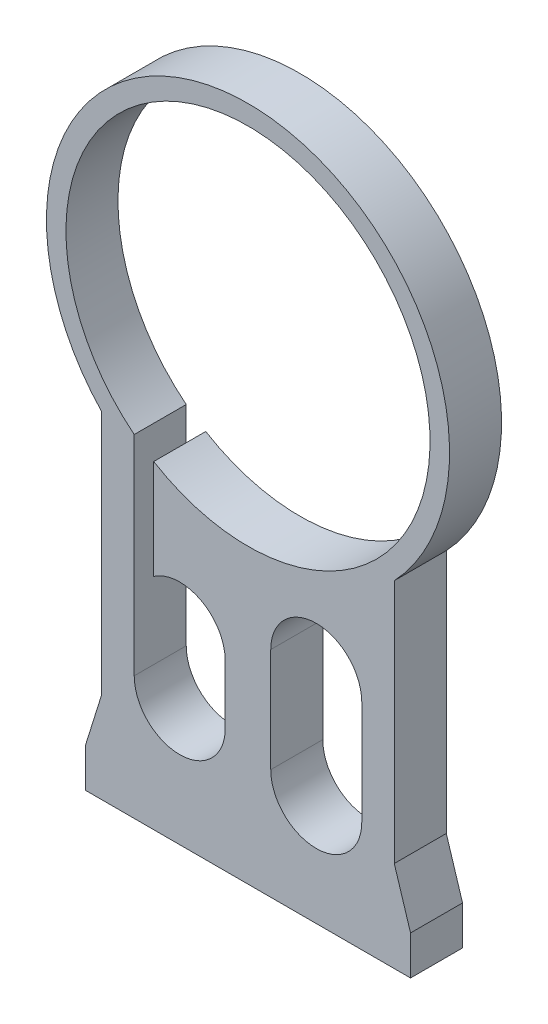
ISO-10303-21;
HEADER;
FILE_DESCRIPTION(('STEP AP214'),'2;1');
FILE_NAME('part.step','',(''),(''),'','','');
FILE_SCHEMA(('AUTOMOTIVE_DESIGN { 1 0 10303 214 1 1 1 1 }'));
ENDSEC;
DATA;
#1=APPLICATION_CONTEXT('core data for automotive mechanical design processes');
#2=APPLICATION_PROTOCOL_DEFINITION('international standard','automotive_design',2000,#1);
#3=PRODUCT_CONTEXT('',#1,'mechanical');
#4=PRODUCT('Part','Part','',(#3));
#5=PRODUCT_RELATED_PRODUCT_CATEGORY('part','',(#4));
#6=PRODUCT_DEFINITION_FORMATION('','',#4);
#7=PRODUCT_DEFINITION_CONTEXT('part definition',#1,'design');
#8=PRODUCT_DEFINITION('design','',#6,#7);
#9=PRODUCT_DEFINITION_SHAPE('','',#8);
#10=(LENGTH_UNIT() NAMED_UNIT(*) SI_UNIT(.MILLI.,.METRE.));
#11=(NAMED_UNIT(*) PLANE_ANGLE_UNIT() SI_UNIT($,.RADIAN.));
#12=(NAMED_UNIT(*) SI_UNIT($,.STERADIAN.) SOLID_ANGLE_UNIT());
#13=UNCERTAINTY_MEASURE_WITH_UNIT(LENGTH_MEASURE(1.E-05),#10,'distance_accuracy_value','');
#14=(GEOMETRIC_REPRESENTATION_CONTEXT(3) GLOBAL_UNCERTAINTY_ASSIGNED_CONTEXT((#13)) GLOBAL_UNIT_ASSIGNED_CONTEXT((#10,
#11,#12)) REPRESENTATION_CONTEXT('',''));
#15=CARTESIAN_POINT('',(0.,0.,0.));
#16=DIRECTION('',(0.,0.,1.));
#17=DIRECTION('',(1.,0.,0.));
#18=AXIS2_PLACEMENT_3D('',#15,#16,#17);
#19=CARTESIAN_POINT('',(0.,36.5,4.));
#20=DIRECTION('',(0.,0.,1.));
#21=DIRECTION('',(1.,0.,0.));
#22=AXIS2_PLACEMENT_3D('',#19,#20,#21);
#23=PLANE('',#22);
#24=DIRECTION('',(-0.298274993135947,-0.95447997803503,0.));
#25=VECTOR('',#24,1.);
#26=CARTESIAN_POINT('',(-12.5,3.,4.));
#27=LINE('',#26,#25);
#28=CARTESIAN_POINT('',(-11.25,7.,4.));
#29=VERTEX_POINT('',#28);
#30=CARTESIAN_POINT('',(-12.5,3.,4.));
#31=VERTEX_POINT('',#30);
#32=EDGE_CURVE('E239',#29,#31,#27,.T.);
#33=ORIENTED_EDGE('',*,*,#32,.T.);
#34=DIRECTION('',(0.,-1.,0.));
#35=VECTOR('',#34,1.);
#36=CARTESIAN_POINT('',(-12.5,0.,4.));
#37=LINE('',#36,#35);
#38=CARTESIAN_POINT('',(-12.5,0.,4.));
#39=VERTEX_POINT('',#38);
#40=EDGE_CURVE('E242',#31,#39,#37,.T.);
#41=ORIENTED_EDGE('',*,*,#40,.T.);
#42=DIRECTION('',(1.,0.,0.));
#43=VECTOR('',#42,1.);
#44=CARTESIAN_POINT('',(12.5,0.,4.));
#45=LINE('',#44,#43);
#46=CARTESIAN_POINT('',(12.5,0.,4.));
#47=VERTEX_POINT('',#46);
#48=EDGE_CURVE('E245',#39,#47,#45,.T.);
#49=ORIENTED_EDGE('',*,*,#48,.T.);
#50=DIRECTION('',(0.,1.,0.));
#51=VECTOR('',#50,1.);
#52=CARTESIAN_POINT('',(12.5,0.,4.));
#53=LINE('',#52,#51);
#54=CARTESIAN_POINT('',(12.5,3.,4.));
#55=VERTEX_POINT('',#54);
#56=EDGE_CURVE('E247',#47,#55,#53,.T.);
#57=ORIENTED_EDGE('',*,*,#56,.T.);
#58=DIRECTION('',(-0.298274993135947,0.95447997803503,0.));
#59=VECTOR('',#58,1.);
#60=CARTESIAN_POINT('',(12.5,3.,4.));
#61=LINE('',#60,#59);
#62=CARTESIAN_POINT('',(11.25,6.99999999999999,4.));
#63=VERTEX_POINT('',#62);
#64=EDGE_CURVE('E249',#55,#63,#61,.T.);
#65=ORIENTED_EDGE('',*,*,#64,.T.);
#66=DIRECTION('',(0.,1.,0.));
#67=VECTOR('',#66,1.);
#68=CARTESIAN_POINT('',(11.25,6.99999999999999,4.));
#69=LINE('',#68,#67);
#70=CARTESIAN_POINT('',(11.25,25.8375659439319,4.));
#71=VERTEX_POINT('',#70);
#72=EDGE_CURVE('E251',#63,#71,#69,.T.);
#73=ORIENTED_EDGE('',*,*,#72,.T.);
#74=CARTESIAN_POINT('',(0.,36.5,4.));
#75=DIRECTION('',(0.,0.,1.));
#76=DIRECTION('',(1.,0.,0.));
#77=AXIS2_PLACEMENT_3D('',#74,#75,#76);
#78=CIRCLE('',#77,15.5);
#79=CARTESIAN_POINT('',(-11.25,25.8375659439319,4.));
#80=VERTEX_POINT('',#79);
#81=EDGE_CURVE('E253',#71,#80,#78,.T.);
#82=ORIENTED_EDGE('',*,*,#81,.T.);
#83=DIRECTION('',(0.,-1.,0.));
#84=VECTOR('',#83,1.);
#85=CARTESIAN_POINT('',(-11.25,7.,4.));
#86=LINE('',#85,#84);
#87=EDGE_CURVE('E255',#80,#29,#86,.T.);
#88=ORIENTED_EDGE('',*,*,#87,.T.);
#89=EDGE_LOOP('',(#33,#41,#49,#57,#65,#73,#82,#88));
#90=FACE_BOUND('',#89,.T.);
#91=DIRECTION('',(0.,1.,0.));
#92=VECTOR('',#91,1.);
#93=CARTESIAN_POINT('',(-7.25,24.5234604329965,4.));
#94=LINE('',#93,#92);
#95=CARTESIAN_POINT('',(-7.25,16.872281323269,4.));
#96=VERTEX_POINT('',#95);
#97=CARTESIAN_POINT('',(-7.25,24.5234604329965,4.));
#98=VERTEX_POINT('',#97);
#99=EDGE_CURVE('E195',#96,#98,#94,.T.);
#100=ORIENTED_EDGE('',*,*,#99,.F.);
#101=CARTESIAN_POINT('',(-5.25,14.,4.));
#102=DIRECTION('',(0.,0.,1.));
#103=DIRECTION('',(1.,0.,0.));
#104=AXIS2_PLACEMENT_3D('',#101,#102,#103);
#105=CIRCLE('',#104,3.5);
#106=CARTESIAN_POINT('',(-1.75,14.,4.));
#107=VERTEX_POINT('',#106);
#108=EDGE_CURVE('E193',#107,#96,#105,.T.);
#109=ORIENTED_EDGE('',*,*,#108,.F.);
#110=DIRECTION('',(0.,1.,0.));
#111=VECTOR('',#110,1.);
#112=CARTESIAN_POINT('',(-1.75,14.,4.));
#113=LINE('',#112,#111);
#114=CARTESIAN_POINT('',(-1.75,9.5,4.));
#115=VERTEX_POINT('',#114);
#116=EDGE_CURVE('E205',#115,#107,#113,.T.);
#117=ORIENTED_EDGE('',*,*,#116,.F.);
#118=CARTESIAN_POINT('',(-5.25,9.5,4.));
#119=DIRECTION('',(0.,0.,1.));
#120=DIRECTION('',(1.,0.,0.));
#121=AXIS2_PLACEMENT_3D('',#118,#119,#120);
#122=CIRCLE('',#121,3.5);
#123=CARTESIAN_POINT('',(-8.75,9.5,4.));
#124=VERTEX_POINT('',#123);
#125=EDGE_CURVE('E202',#124,#115,#122,.T.);
#126=ORIENTED_EDGE('',*,*,#125,.F.);
#127=DIRECTION('',(0.,-1.,0.));
#128=VECTOR('',#127,1.);
#129=CARTESIAN_POINT('',(-8.75,14.,4.));
#130=LINE('',#129,#128);
#131=CARTESIAN_POINT('',(-8.75,25.5712535028028,4.));
#132=VERTEX_POINT('',#131);
#133=EDGE_CURVE('E200',#132,#124,#130,.T.);
#134=ORIENTED_EDGE('',*,*,#133,.F.);
#135=CARTESIAN_POINT('',(0.,36.5,4.));
#136=DIRECTION('',(0.,0.,1.));
#137=DIRECTION('',(1.,0.,0.));
#138=AXIS2_PLACEMENT_3D('',#135,#136,#137);
#139=CIRCLE('',#138,14.);
#140=EDGE_CURVE('E198',#98,#132,#139,.T.);
#141=ORIENTED_EDGE('',*,*,#140,.F.);
#142=EDGE_LOOP('',(#100,#109,#117,#126,#134,#141));
#143=FACE_BOUND('',#142,.T.);
#144=DIRECTION('',(0.,-1.,0.));
#145=VECTOR('',#144,1.);
#146=CARTESIAN_POINT('',(1.74999999999999,16.5,4.));
#147=LINE('',#146,#145);
#148=CARTESIAN_POINT('',(1.74999999999999,16.5,4.));
#149=VERTEX_POINT('',#148);
#150=CARTESIAN_POINT('',(1.75,8.5,4.));
#151=VERTEX_POINT('',#150);
#152=EDGE_CURVE('E165',#149,#151,#147,.T.);
#153=ORIENTED_EDGE('',*,*,#152,.F.);
#154=CARTESIAN_POINT('',(5.25,16.5,4.));
#155=DIRECTION('',(0.,0.,1.));
#156=DIRECTION('',(1.,0.,0.));
#157=AXIS2_PLACEMENT_3D('',#154,#155,#156);
#158=CIRCLE('',#157,3.5);
#159=CARTESIAN_POINT('',(8.75,16.5,4.));
#160=VERTEX_POINT('',#159);
#161=EDGE_CURVE('E157',#160,#149,#158,.T.);
#162=ORIENTED_EDGE('',*,*,#161,.F.);
#163=DIRECTION('',(0.,1.,0.));
#164=VECTOR('',#163,1.);
#165=CARTESIAN_POINT('',(8.75,16.5,4.));
#166=LINE('',#165,#164);
#167=CARTESIAN_POINT('',(8.75,8.5,4.));
#168=VERTEX_POINT('',#167);
#169=EDGE_CURVE('E179',#168,#160,#166,.T.);
#170=ORIENTED_EDGE('',*,*,#169,.F.);
#171=CARTESIAN_POINT('',(5.25,8.5,4.));
#172=DIRECTION('',(0.,0.,1.));
#173=DIRECTION('',(1.,0.,0.));
#174=AXIS2_PLACEMENT_3D('',#171,#172,#173);
#175=CIRCLE('',#174,3.5);
#176=EDGE_CURVE('E177',#151,#168,#175,.T.);
#177=ORIENTED_EDGE('',*,*,#176,.F.);
#178=EDGE_LOOP('',(#153,#162,#170,#177));
#179=FACE_BOUND('',#178,.T.);
#180=ADVANCED_FACE('F32',(#90,#143,#179),#23,.T.);
#181=CARTESIAN_POINT('',(0.,36.5,0.));
#182=DIRECTION('',(0.,0.,1.));
#183=DIRECTION('',(1.,0.,0.));
#184=AXIS2_PLACEMENT_3D('',#181,#182,#183);
#185=PLANE('',#184);
#186=CARTESIAN_POINT('',(-5.25,14.,0.));
#187=DIRECTION('',(0.,0.,1.));
#188=DIRECTION('',(1.,0.,0.));
#189=AXIS2_PLACEMENT_3D('',#186,#187,#188);
#190=CIRCLE('',#189,3.5);
#191=CARTESIAN_POINT('',(-1.75,14.,0.));
#192=VERTEX_POINT('',#191);
#193=CARTESIAN_POINT('',(-7.25,16.872281323269,0.));
#194=VERTEX_POINT('',#193);
#195=EDGE_CURVE('E173',#192,#194,#190,.T.);
#196=ORIENTED_EDGE('',*,*,#195,.T.);
#197=DIRECTION('',(0.,1.,0.));
#198=VECTOR('',#197,1.);
#199=CARTESIAN_POINT('',(-7.25,24.5234604329965,0.));
#200=LINE('',#199,#198);
#201=CARTESIAN_POINT('',(-7.25,24.5234604329965,0.));
#202=VERTEX_POINT('',#201);
#203=EDGE_CURVE('E210',#194,#202,#200,.T.);
#204=ORIENTED_EDGE('',*,*,#203,.T.);
#205=CARTESIAN_POINT('',(0.,36.5,0.));
#206=DIRECTION('',(0.,0.,1.));
#207=DIRECTION('',(1.,0.,0.));
#208=AXIS2_PLACEMENT_3D('',#205,#206,#207);
#209=CIRCLE('',#208,14.);
#210=CARTESIAN_POINT('',(-8.75,25.5712535028028,0.));
#211=VERTEX_POINT('',#210);
#212=EDGE_CURVE('E213',#202,#211,#209,.T.);
#213=ORIENTED_EDGE('',*,*,#212,.T.);
#214=DIRECTION('',(0.,-1.,0.));
#215=VECTOR('',#214,1.);
#216=CARTESIAN_POINT('',(-8.75,14.,0.));
#217=LINE('',#216,#215);
#218=CARTESIAN_POINT('',(-8.75,9.5,0.));
#219=VERTEX_POINT('',#218);
#220=EDGE_CURVE('E216',#211,#219,#217,.T.);
#221=ORIENTED_EDGE('',*,*,#220,.T.);
#222=CARTESIAN_POINT('',(-5.25,9.5,0.));
#223=DIRECTION('',(0.,0.,1.));
#224=DIRECTION('',(1.,0.,0.));
#225=AXIS2_PLACEMENT_3D('',#222,#223,#224);
#226=CIRCLE('',#225,3.5);
#227=CARTESIAN_POINT('',(-1.75,9.5,0.));
#228=VERTEX_POINT('',#227);
#229=EDGE_CURVE('E219',#219,#228,#226,.T.);
#230=ORIENTED_EDGE('',*,*,#229,.T.);
#231=DIRECTION('',(0.,1.,0.));
#232=VECTOR('',#231,1.);
#233=CARTESIAN_POINT('',(-1.75,14.,0.));
#234=LINE('',#233,#232);
#235=EDGE_CURVE('E196',#228,#192,#234,.T.);
#236=ORIENTED_EDGE('',*,*,#235,.T.);
#237=EDGE_LOOP('',(#196,#204,#213,#221,#230,#236));
#238=FACE_BOUND('',#237,.T.);
#239=DIRECTION('',(-0.298274993135947,-0.95447997803503,0.));
#240=VECTOR('',#239,1.);
#241=CARTESIAN_POINT('',(-12.5,3.,0.));
#242=LINE('',#241,#240);
#243=CARTESIAN_POINT('',(-11.25,7.,0.));
#244=VERTEX_POINT('',#243);
#245=CARTESIAN_POINT('',(-12.5,3.,0.));
#246=VERTEX_POINT('',#245);
#247=EDGE_CURVE('E238',#244,#246,#242,.T.);
#248=ORIENTED_EDGE('',*,*,#247,.F.);
#249=DIRECTION('',(0.,-1.,0.));
#250=VECTOR('',#249,1.);
#251=CARTESIAN_POINT('',(-11.25,7.,0.));
#252=LINE('',#251,#250);
#253=CARTESIAN_POINT('',(-11.25,25.8375659439319,0.));
#254=VERTEX_POINT('',#253);
#255=EDGE_CURVE('E243',#254,#244,#252,.T.);
#256=ORIENTED_EDGE('',*,*,#255,.F.);
#257=CARTESIAN_POINT('',(0.,36.5,0.));
#258=DIRECTION('',(0.,0.,1.));
#259=DIRECTION('',(1.,0.,0.));
#260=AXIS2_PLACEMENT_3D('',#257,#258,#259);
#261=CIRCLE('',#260,15.5);
#262=CARTESIAN_POINT('',(11.25,25.8375659439319,0.));
#263=VERTEX_POINT('',#262);
#264=EDGE_CURVE('E270',#263,#254,#261,.T.);
#265=ORIENTED_EDGE('',*,*,#264,.F.);
#266=DIRECTION('',(0.,1.,0.));
#267=VECTOR('',#266,1.);
#268=CARTESIAN_POINT('',(11.25,6.99999999999999,0.));
#269=LINE('',#268,#267);
#270=CARTESIAN_POINT('',(11.25,6.99999999999999,0.));
#271=VERTEX_POINT('',#270);
#272=EDGE_CURVE('E268',#271,#263,#269,.T.);
#273=ORIENTED_EDGE('',*,*,#272,.F.);
#274=DIRECTION('',(-0.298274993135947,0.95447997803503,0.));
#275=VECTOR('',#274,1.);
#276=CARTESIAN_POINT('',(12.5,3.,0.));
#277=LINE('',#276,#275);
#278=CARTESIAN_POINT('',(12.5,3.,0.));
#279=VERTEX_POINT('',#278);
#280=EDGE_CURVE('E266',#279,#271,#277,.T.);
#281=ORIENTED_EDGE('',*,*,#280,.F.);
#282=DIRECTION('',(0.,1.,0.));
#283=VECTOR('',#282,1.);
#284=CARTESIAN_POINT('',(12.5,0.,0.));
#285=LINE('',#284,#283);
#286=CARTESIAN_POINT('',(12.5,0.,0.));
#287=VERTEX_POINT('',#286);
#288=EDGE_CURVE('E264',#287,#279,#285,.T.);
#289=ORIENTED_EDGE('',*,*,#288,.F.);
#290=DIRECTION('',(1.,0.,0.));
#291=VECTOR('',#290,1.);
#292=CARTESIAN_POINT('',(12.5,0.,0.));
#293=LINE('',#292,#291);
#294=CARTESIAN_POINT('',(-12.5,0.,0.));
#295=VERTEX_POINT('',#294);
#296=EDGE_CURVE('E262',#295,#287,#293,.T.);
#297=ORIENTED_EDGE('',*,*,#296,.F.);
#298=DIRECTION('',(0.,-1.,0.));
#299=VECTOR('',#298,1.);
#300=CARTESIAN_POINT('',(-12.5,0.,0.));
#301=LINE('',#300,#299);
#302=EDGE_CURVE('E260',#246,#295,#301,.T.);
#303=ORIENTED_EDGE('',*,*,#302,.F.);
#304=EDGE_LOOP('',(#248,#256,#265,#273,#281,#289,#297,#303));
#305=FACE_BOUND('',#304,.T.);
#306=CARTESIAN_POINT('',(5.25,16.5,0.));
#307=DIRECTION('',(0.,0.,1.));
#308=DIRECTION('',(1.,0.,0.));
#309=AXIS2_PLACEMENT_3D('',#306,#307,#308);
#310=CIRCLE('',#309,3.5);
#311=CARTESIAN_POINT('',(8.75,16.5,0.));
#312=VERTEX_POINT('',#311);
#313=CARTESIAN_POINT('',(1.74999999999999,16.5,0.));
#314=VERTEX_POINT('',#313);
#315=EDGE_CURVE('E55',#312,#314,#310,.T.);
#316=ORIENTED_EDGE('',*,*,#315,.T.);
#317=DIRECTION('',(0.,-1.,0.));
#318=VECTOR('',#317,1.);
#319=CARTESIAN_POINT('',(1.74999999999999,16.5,0.));
#320=LINE('',#319,#318);
#321=CARTESIAN_POINT('',(1.75,8.5,0.));
#322=VERTEX_POINT('',#321);
#323=EDGE_CURVE('E172',#314,#322,#320,.T.);
#324=ORIENTED_EDGE('',*,*,#323,.T.);
#325=CARTESIAN_POINT('',(5.25,8.5,0.));
#326=DIRECTION('',(0.,0.,1.));
#327=DIRECTION('',(1.,0.,0.));
#328=AXIS2_PLACEMENT_3D('',#325,#326,#327);
#329=CIRCLE('',#328,3.5);
#330=CARTESIAN_POINT('',(8.75,8.5,0.));
#331=VERTEX_POINT('',#330);
#332=EDGE_CURVE('E185',#322,#331,#329,.T.);
#333=ORIENTED_EDGE('',*,*,#332,.T.);
#334=DIRECTION('',(0.,1.,0.));
#335=VECTOR('',#334,1.);
#336=CARTESIAN_POINT('',(8.75,16.5,0.));
#337=LINE('',#336,#335);
#338=EDGE_CURVE('E166',#331,#312,#337,.T.);
#339=ORIENTED_EDGE('',*,*,#338,.T.);
#340=EDGE_LOOP('',(#316,#324,#333,#339));
#341=FACE_BOUND('',#340,.T.);
#342=ADVANCED_FACE('F300',(#238,#305,#341),#185,.F.);
#343=CARTESIAN_POINT('',(-12.5,3.,4.));
#344=DIRECTION('',(0.95447997803503,-0.298274993135947,0.));
#345=DIRECTION('',(0.298274993135947,0.95447997803503,0.));
#346=AXIS2_PLACEMENT_3D('',#343,#344,#345);
#347=PLANE('',#346);
#348=ORIENTED_EDGE('',*,*,#247,.T.);
#349=DIRECTION('',(0.,0.,-1.));
#350=VECTOR('',#349,1.);
#351=CARTESIAN_POINT('',(-12.5,3.,4.));
#352=LINE('',#351,#350);
#353=EDGE_CURVE('E11',#31,#246,#352,.T.);
#354=ORIENTED_EDGE('',*,*,#353,.F.);
#355=ORIENTED_EDGE('',*,*,#32,.F.);
#356=DIRECTION('',(0.,0.,-1.));
#357=VECTOR('',#356,1.);
#358=CARTESIAN_POINT('',(-11.25,7.,4.));
#359=LINE('',#358,#357);
#360=EDGE_CURVE('E257',#29,#244,#359,.T.);
#361=ORIENTED_EDGE('',*,*,#360,.T.);
#362=EDGE_LOOP('',(#348,#354,#355,#361));
#363=FACE_BOUND('',#362,.T.);
#364=ADVANCED_FACE('F34',(#363),#347,.F.);
#365=CARTESIAN_POINT('',(-12.5,0.,4.));
#366=DIRECTION('',(1.,0.,0.));
#367=DIRECTION('',(0.,0.,-1.));
#368=AXIS2_PLACEMENT_3D('',#365,#366,#367);
#369=PLANE('',#368);
#370=ORIENTED_EDGE('',*,*,#302,.T.);
#371=DIRECTION('',(0.,0.,-1.));
#372=VECTOR('',#371,1.);
#373=CARTESIAN_POINT('',(-12.5,0.,4.));
#374=LINE('',#373,#372);
#375=EDGE_CURVE('E40',#39,#295,#374,.T.);
#376=ORIENTED_EDGE('',*,*,#375,.F.);
#377=ORIENTED_EDGE('',*,*,#40,.F.);
#378=ORIENTED_EDGE('',*,*,#353,.T.);
#379=EDGE_LOOP('',(#370,#376,#377,#378));
#380=FACE_BOUND('',#379,.T.);
#381=ADVANCED_FACE('F318',(#380),#369,.F.);
#382=CARTESIAN_POINT('',(12.5,0.,4.));
#383=DIRECTION('',(0.,1.,0.));
#384=DIRECTION('',(-1.,0.,0.));
#385=AXIS2_PLACEMENT_3D('',#382,#383,#384);
#386=PLANE('',#385);
#387=ORIENTED_EDGE('',*,*,#296,.T.);
#388=DIRECTION('',(0.,0.,-1.));
#389=VECTOR('',#388,1.);
#390=CARTESIAN_POINT('',(12.5,0.,4.));
#391=LINE('',#390,#389);
#392=EDGE_CURVE('E287',#47,#287,#391,.T.);
#393=ORIENTED_EDGE('',*,*,#392,.F.);
#394=ORIENTED_EDGE('',*,*,#48,.F.);
#395=ORIENTED_EDGE('',*,*,#375,.T.);
#396=EDGE_LOOP('',(#387,#393,#394,#395));
#397=FACE_BOUND('',#396,.T.);
#398=ADVANCED_FACE('F294',(#397),#386,.F.);
#399=CARTESIAN_POINT('',(12.5,0.,4.));
#400=DIRECTION('',(-1.,0.,0.));
#401=DIRECTION('',(0.,0.,1.));
#402=AXIS2_PLACEMENT_3D('',#399,#400,#401);
#403=PLANE('',#402);
#404=ORIENTED_EDGE('',*,*,#288,.T.);
#405=DIRECTION('',(0.,0.,-1.));
#406=VECTOR('',#405,1.);
#407=CARTESIAN_POINT('',(12.5,3.,4.));
#408=LINE('',#407,#406);
#409=EDGE_CURVE('E284',#55,#279,#408,.T.);
#410=ORIENTED_EDGE('',*,*,#409,.F.);
#411=ORIENTED_EDGE('',*,*,#56,.F.);
#412=ORIENTED_EDGE('',*,*,#392,.T.);
#413=EDGE_LOOP('',(#404,#410,#411,#412));
#414=FACE_BOUND('',#413,.T.);
#415=ADVANCED_FACE('F306',(#414),#403,.F.);
#416=CARTESIAN_POINT('',(12.5,3.,4.));
#417=DIRECTION('',(-0.95447997803503,-0.298274993135947,0.));
#418=DIRECTION('',(0.298274993135947,-0.95447997803503,0.));
#419=AXIS2_PLACEMENT_3D('',#416,#417,#418);
#420=PLANE('',#419);
#421=ORIENTED_EDGE('',*,*,#280,.T.);
#422=DIRECTION('',(0.,0.,-1.));
#423=VECTOR('',#422,1.);
#424=CARTESIAN_POINT('',(11.25,6.99999999999999,4.));
#425=LINE('',#424,#423);
#426=EDGE_CURVE('E281',#63,#271,#425,.T.);
#427=ORIENTED_EDGE('',*,*,#426,.F.);
#428=ORIENTED_EDGE('',*,*,#64,.F.);
#429=ORIENTED_EDGE('',*,*,#409,.T.);
#430=EDGE_LOOP('',(#421,#427,#428,#429));
#431=FACE_BOUND('',#430,.T.);
#432=ADVANCED_FACE('F310',(#431),#420,.F.);
#433=CARTESIAN_POINT('',(11.25,6.99999999999999,4.));
#434=DIRECTION('',(-1.,0.,0.));
#435=DIRECTION('',(0.,0.,1.));
#436=AXIS2_PLACEMENT_3D('',#433,#434,#435);
#437=PLANE('',#436);
#438=ORIENTED_EDGE('',*,*,#272,.T.);
#439=DIRECTION('',(0.,0.,-1.));
#440=VECTOR('',#439,1.);
#441=CARTESIAN_POINT('',(11.25,25.8375659439319,4.));
#442=LINE('',#441,#440);
#443=EDGE_CURVE('E278',#71,#263,#442,.T.);
#444=ORIENTED_EDGE('',*,*,#443,.F.);
#445=ORIENTED_EDGE('',*,*,#72,.F.);
#446=ORIENTED_EDGE('',*,*,#426,.T.);
#447=EDGE_LOOP('',(#438,#444,#445,#446));
#448=FACE_BOUND('',#447,.T.);
#449=ADVANCED_FACE('F331',(#448),#437,.F.);
#450=CARTESIAN_POINT('',(0.,36.5,4.));
#451=DIRECTION('',(0.,0.,-1.));
#452=DIRECTION('',(-1.,0.,0.));
#453=AXIS2_PLACEMENT_3D('',#450,#451,#452);
#454=CYLINDRICAL_SURFACE('',#453,15.5);
#455=ORIENTED_EDGE('',*,*,#264,.T.);
#456=DIRECTION('',(0.,0.,-1.));
#457=VECTOR('',#456,1.);
#458=CARTESIAN_POINT('',(-11.25,25.8375659439319,4.));
#459=LINE('',#458,#457);
#460=EDGE_CURVE('E275',#80,#254,#459,.T.);
#461=ORIENTED_EDGE('',*,*,#460,.F.);
#462=ORIENTED_EDGE('',*,*,#81,.F.);
#463=ORIENTED_EDGE('',*,*,#443,.T.);
#464=EDGE_LOOP('',(#455,#461,#462,#463));
#465=FACE_BOUND('',#464,.T.);
#466=ADVANCED_FACE('F329',(#465),#454,.T.);
#467=CARTESIAN_POINT('',(-11.25,7.,4.));
#468=DIRECTION('',(1.,0.,0.));
#469=DIRECTION('',(0.,0.,-1.));
#470=AXIS2_PLACEMENT_3D('',#467,#468,#469);
#471=PLANE('',#470);
#472=ORIENTED_EDGE('',*,*,#255,.T.);
#473=ORIENTED_EDGE('',*,*,#360,.F.);
#474=ORIENTED_EDGE('',*,*,#87,.F.);
#475=ORIENTED_EDGE('',*,*,#460,.T.);
#476=EDGE_LOOP('',(#472,#473,#474,#475));
#477=FACE_BOUND('',#476,.T.);
#478=ADVANCED_FACE('F324',(#477),#471,.F.);
#479=CARTESIAN_POINT('',(-5.25,14.,4.));
#480=DIRECTION('',(0.,0.,-1.));
#481=DIRECTION('',(-1.,0.,0.));
#482=AXIS2_PLACEMENT_3D('',#479,#480,#481);
#483=CYLINDRICAL_SURFACE('',#482,3.5);
#484=ORIENTED_EDGE('',*,*,#195,.F.);
#485=DIRECTION('',(0.,0.,-1.));
#486=VECTOR('',#485,1.);
#487=CARTESIAN_POINT('',(-1.75,14.,4.));
#488=LINE('',#487,#486);
#489=EDGE_CURVE('E207',#107,#192,#488,.T.);
#490=ORIENTED_EDGE('',*,*,#489,.F.);
#491=ORIENTED_EDGE('',*,*,#108,.T.);
#492=DIRECTION('',(0.,0.,-1.));
#493=VECTOR('',#492,1.);
#494=CARTESIAN_POINT('',(-7.25,16.872281323269,4.));
#495=LINE('',#494,#493);
#496=EDGE_CURVE('E235',#96,#194,#495,.T.);
#497=ORIENTED_EDGE('',*,*,#496,.T.);
#498=EDGE_LOOP('',(#484,#490,#491,#497));
#499=FACE_BOUND('',#498,.T.);
#500=ADVANCED_FACE('F348',(#499),#483,.F.);
#501=CARTESIAN_POINT('',(-7.25,24.5234604329965,4.));
#502=DIRECTION('',(-1.,0.,0.));
#503=DIRECTION('',(0.,-1.,0.));
#504=AXIS2_PLACEMENT_3D('',#501,#502,#503);
#505=PLANE('',#504);
#506=ORIENTED_EDGE('',*,*,#203,.F.);
#507=ORIENTED_EDGE('',*,*,#496,.F.);
#508=ORIENTED_EDGE('',*,*,#99,.T.);
#509=DIRECTION('',(0.,0.,-1.));
#510=VECTOR('',#509,1.);
#511=CARTESIAN_POINT('',(-7.25,24.5234604329965,4.));
#512=LINE('',#511,#510);
#513=EDGE_CURVE('E233',#98,#202,#512,.T.);
#514=ORIENTED_EDGE('',*,*,#513,.T.);
#515=EDGE_LOOP('',(#506,#507,#508,#514));
#516=FACE_BOUND('',#515,.T.);
#517=ADVANCED_FACE('F355',(#516),#505,.T.);
#518=CARTESIAN_POINT('',(0.,36.5,4.));
#519=DIRECTION('',(0.,0.,-1.));
#520=DIRECTION('',(-1.,0.,0.));
#521=AXIS2_PLACEMENT_3D('',#518,#519,#520);
#522=CYLINDRICAL_SURFACE('',#521,14.);
#523=ORIENTED_EDGE('',*,*,#212,.F.);
#524=ORIENTED_EDGE('',*,*,#513,.F.);
#525=ORIENTED_EDGE('',*,*,#140,.T.);
#526=DIRECTION('',(0.,0.,-1.));
#527=VECTOR('',#526,1.);
#528=CARTESIAN_POINT('',(-8.75,25.5712535028028,4.));
#529=LINE('',#528,#527);
#530=EDGE_CURVE('E230',#132,#211,#529,.T.);
#531=ORIENTED_EDGE('',*,*,#530,.T.);
#532=EDGE_LOOP('',(#523,#524,#525,#531));
#533=FACE_BOUND('',#532,.T.);
#534=ADVANCED_FACE('F360',(#533),#522,.F.);
#535=CARTESIAN_POINT('',(-8.75,14.,4.));
#536=DIRECTION('',(1.,0.,0.));
#537=DIRECTION('',(0.,0.,-1.));
#538=AXIS2_PLACEMENT_3D('',#535,#536,#537);
#539=PLANE('',#538);
#540=ORIENTED_EDGE('',*,*,#220,.F.);
#541=ORIENTED_EDGE('',*,*,#530,.F.);
#542=ORIENTED_EDGE('',*,*,#133,.T.);
#543=DIRECTION('',(0.,0.,-1.));
#544=VECTOR('',#543,1.);
#545=CARTESIAN_POINT('',(-8.75,9.5,4.));
#546=LINE('',#545,#544);
#547=EDGE_CURVE('E228',#124,#219,#546,.T.);
#548=ORIENTED_EDGE('',*,*,#547,.T.);
#549=EDGE_LOOP('',(#540,#541,#542,#548));
#550=FACE_BOUND('',#549,.T.);
#551=ADVANCED_FACE('F382',(#550),#539,.T.);
#552=CARTESIAN_POINT('',(-5.25,9.5,4.));
#553=DIRECTION('',(0.,0.,-1.));
#554=DIRECTION('',(-1.,0.,0.));
#555=AXIS2_PLACEMENT_3D('',#552,#553,#554);
#556=CYLINDRICAL_SURFACE('',#555,3.5);
#557=ORIENTED_EDGE('',*,*,#229,.F.);
#558=ORIENTED_EDGE('',*,*,#547,.F.);
#559=ORIENTED_EDGE('',*,*,#125,.T.);
#560=DIRECTION('',(0.,0.,-1.));
#561=VECTOR('',#560,1.);
#562=CARTESIAN_POINT('',(-1.75,9.5,4.));
#563=LINE('',#562,#561);
#564=EDGE_CURVE('E226',#115,#228,#563,.T.);
#565=ORIENTED_EDGE('',*,*,#564,.T.);
#566=EDGE_LOOP('',(#557,#558,#559,#565));
#567=FACE_BOUND('',#566,.T.);
#568=ADVANCED_FACE('F372',(#567),#556,.F.);
#569=CARTESIAN_POINT('',(-1.75,14.,4.));
#570=DIRECTION('',(-1.,0.,0.));
#571=DIRECTION('',(0.,-1.,0.));
#572=AXIS2_PLACEMENT_3D('',#569,#570,#571);
#573=PLANE('',#572);
#574=ORIENTED_EDGE('',*,*,#235,.F.);
#575=ORIENTED_EDGE('',*,*,#564,.F.);
#576=ORIENTED_EDGE('',*,*,#116,.T.);
#577=ORIENTED_EDGE('',*,*,#489,.T.);
#578=EDGE_LOOP('',(#574,#575,#576,#577));
#579=FACE_BOUND('',#578,.T.);
#580=ADVANCED_FACE('F367',(#579),#573,.T.);
#581=CARTESIAN_POINT('',(5.25,16.5,4.));
#582=DIRECTION('',(0.,0.,-1.));
#583=DIRECTION('',(-1.,0.,0.));
#584=AXIS2_PLACEMENT_3D('',#581,#582,#583);
#585=CYLINDRICAL_SURFACE('',#584,3.5);
#586=ORIENTED_EDGE('',*,*,#315,.F.);
#587=DIRECTION('',(0.,0.,-1.));
#588=VECTOR('',#587,1.);
#589=CARTESIAN_POINT('',(8.75,16.5,4.));
#590=LINE('',#589,#588);
#591=EDGE_CURVE('E161',#160,#312,#590,.T.);
#592=ORIENTED_EDGE('',*,*,#591,.F.);
#593=ORIENTED_EDGE('',*,*,#161,.T.);
#594=DIRECTION('',(0.,0.,-1.));
#595=VECTOR('',#594,1.);
#596=CARTESIAN_POINT('',(1.74999999999999,16.5,4.));
#597=LINE('',#596,#595);
#598=EDGE_CURVE('E160',#149,#314,#597,.T.);
#599=ORIENTED_EDGE('',*,*,#598,.T.);
#600=EDGE_LOOP('',(#586,#592,#593,#599));
#601=FACE_BOUND('',#600,.T.);
#602=ADVANCED_FACE('F159',(#601),#585,.F.);
#603=CARTESIAN_POINT('',(1.74999999999999,16.5,4.));
#604=DIRECTION('',(1.,0.,0.));
#605=DIRECTION('',(0.,1.,0.));
#606=AXIS2_PLACEMENT_3D('',#603,#604,#605);
#607=PLANE('',#606);
#608=ORIENTED_EDGE('',*,*,#323,.F.);
#609=ORIENTED_EDGE('',*,*,#598,.F.);
#610=ORIENTED_EDGE('',*,*,#152,.T.);
#611=DIRECTION('',(0.,0.,-1.));
#612=VECTOR('',#611,1.);
#613=CARTESIAN_POINT('',(1.75,8.5,4.));
#614=LINE('',#613,#612);
#615=EDGE_CURVE('E174',#151,#322,#614,.T.);
#616=ORIENTED_EDGE('',*,*,#615,.T.);
#617=EDGE_LOOP('',(#608,#609,#610,#616));
#618=FACE_BOUND('',#617,.T.);
#619=ADVANCED_FACE('F169',(#618),#607,.T.);
#620=CARTESIAN_POINT('',(5.25,8.5,4.));
#621=DIRECTION('',(0.,0.,-1.));
#622=DIRECTION('',(-1.,0.,0.));
#623=AXIS2_PLACEMENT_3D('',#620,#621,#622);
#624=CYLINDRICAL_SURFACE('',#623,3.5);
#625=ORIENTED_EDGE('',*,*,#332,.F.);
#626=ORIENTED_EDGE('',*,*,#615,.F.);
#627=ORIENTED_EDGE('',*,*,#176,.T.);
#628=DIRECTION('',(0.,0.,-1.));
#629=VECTOR('',#628,1.);
#630=CARTESIAN_POINT('',(8.75,8.5,4.));
#631=LINE('',#630,#629);
#632=EDGE_CURVE('E47',#168,#331,#631,.T.);
#633=ORIENTED_EDGE('',*,*,#632,.T.);
#634=EDGE_LOOP('',(#625,#626,#627,#633));
#635=FACE_BOUND('',#634,.T.);
#636=ADVANCED_FACE('F398',(#635),#624,.F.);
#637=CARTESIAN_POINT('',(8.75,16.5,4.));
#638=DIRECTION('',(-1.,0.,0.));
#639=DIRECTION('',(0.,0.,1.));
#640=AXIS2_PLACEMENT_3D('',#637,#638,#639);
#641=PLANE('',#640);
#642=ORIENTED_EDGE('',*,*,#338,.F.);
#643=ORIENTED_EDGE('',*,*,#632,.F.);
#644=ORIENTED_EDGE('',*,*,#169,.T.);
#645=ORIENTED_EDGE('',*,*,#591,.T.);
#646=EDGE_LOOP('',(#642,#643,#644,#645));
#647=FACE_BOUND('',#646,.T.);
#648=ADVANCED_FACE('F401',(#647),#641,.T.);
#649=CLOSED_SHELL('',(#180,#342,#364,#381,#398,#415,#432,#449,#466,#478,#500,#517,#534,#551,
#568,#580,#602,#619,#636,#648));
#650=MANIFOLD_SOLID_BREP('B2',#649);
#651=ADVANCED_BREP_SHAPE_REPRESENTATION('',(#18,#650),#14);
#652=SHAPE_DEFINITION_REPRESENTATION(#9,#651);
ENDSEC;
END-ISO-10303-21;
